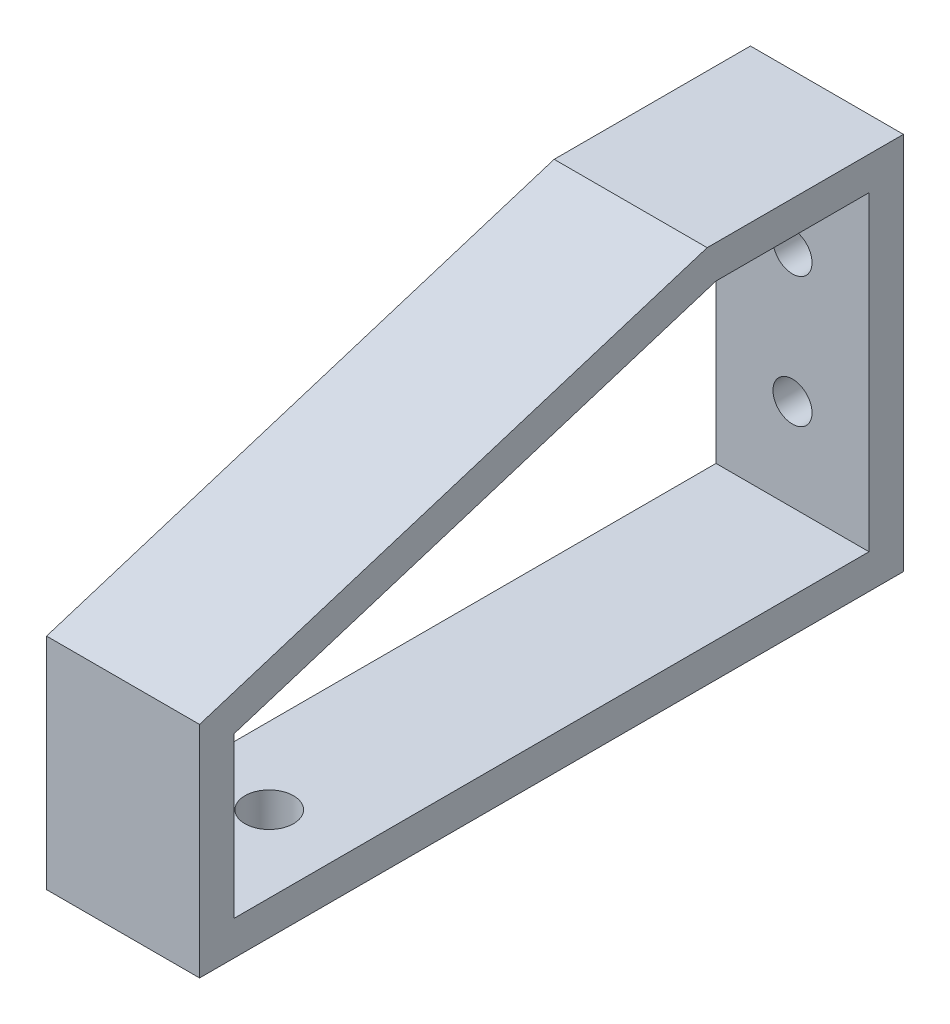
ISO-10303-21;
HEADER;
FILE_DESCRIPTION(('STEP AP214'),'2;1');
FILE_NAME('part.step','',(''),(''),'','','');
FILE_SCHEMA(('AUTOMOTIVE_DESIGN { 1 0 10303 214 1 1 1 1 }'));
ENDSEC;
DATA;
#1=APPLICATION_CONTEXT('core data for automotive mechanical design processes');
#2=APPLICATION_PROTOCOL_DEFINITION('international standard','automotive_design',2000,#1);
#3=PRODUCT_CONTEXT('',#1,'mechanical');
#4=PRODUCT('Part','Part','',(#3));
#5=PRODUCT_RELATED_PRODUCT_CATEGORY('part','',(#4));
#6=PRODUCT_DEFINITION_FORMATION('','',#4);
#7=PRODUCT_DEFINITION_CONTEXT('part definition',#1,'design');
#8=PRODUCT_DEFINITION('design','',#6,#7);
#9=PRODUCT_DEFINITION_SHAPE('','',#8);
#10=(LENGTH_UNIT() NAMED_UNIT(*) SI_UNIT(.MILLI.,.METRE.));
#11=(NAMED_UNIT(*) PLANE_ANGLE_UNIT() SI_UNIT($,.RADIAN.));
#12=(NAMED_UNIT(*) SI_UNIT($,.STERADIAN.) SOLID_ANGLE_UNIT());
#13=UNCERTAINTY_MEASURE_WITH_UNIT(LENGTH_MEASURE(1.E-05),#10,'distance_accuracy_value','');
#14=(GEOMETRIC_REPRESENTATION_CONTEXT(3) GLOBAL_UNCERTAINTY_ASSIGNED_CONTEXT((#13)) GLOBAL_UNIT_ASSIGNED_CONTEXT((#10,
#11,#12)) REPRESENTATION_CONTEXT('',''));
#15=CARTESIAN_POINT('',(0.,0.,0.));
#16=DIRECTION('',(0.,0.,1.));
#17=DIRECTION('',(1.,0.,0.));
#18=AXIS2_PLACEMENT_3D('',#15,#16,#17);
#19=CARTESIAN_POINT('',(59.7375223861297,0.,4.5));
#20=DIRECTION('',(-1.,0.,0.));
#21=DIRECTION('',(0.,-1.,0.));
#22=AXIS2_PLACEMENT_3D('',#19,#20,#21);
#23=PLANE('',#22);
#24=DIRECTION('',(0.,0.,1.));
#25=VECTOR('',#24,1.);
#26=CARTESIAN_POINT('',(59.7375223861297,-80.5485327504544,0.));
#27=LINE('',#26,#25);
#28=CARTESIAN_POINT('',(59.7375223861297,-80.5485327504544,0.));
#29=VERTEX_POINT('',#28);
#30=CARTESIAN_POINT('',(59.7375223861297,-80.5485327504544,92.));
#31=VERTEX_POINT('',#30);
#32=EDGE_CURVE('E116',#29,#31,#27,.T.);
#33=ORIENTED_EDGE('',*,*,#32,.T.);
#34=DIRECTION('',(0.,1.,0.));
#35=VECTOR('',#34,1.);
#36=CARTESIAN_POINT('',(59.7375223861297,0.,92.));
#37=LINE('',#36,#35);
#38=CARTESIAN_POINT('',(59.7375223861297,-51.8430940574358,92.));
#39=VERTEX_POINT('',#38);
#40=EDGE_CURVE('E109',#31,#39,#37,.T.);
#41=ORIENTED_EDGE('',*,*,#40,.T.);
#42=DIRECTION('',(0.,0.299079339607756,-0.954228247653458));
#43=VECTOR('',#42,1.);
#44=CARTESIAN_POINT('',(59.7375223861297,-20.9499337980594,-6.56624070871699));
#45=LINE('',#44,#43);
#46=CARTESIAN_POINT('',(59.7375223861297,-31.0485327504544,25.6538664867085));
#47=VERTEX_POINT('',#46);
#48=EDGE_CURVE('E106',#39,#47,#45,.T.);
#49=ORIENTED_EDGE('',*,*,#48,.T.);
#50=DIRECTION('',(0.,0.,-1.));
#51=VECTOR('',#50,1.);
#52=CARTESIAN_POINT('',(59.7375223861297,-31.0485327504544,4.5));
#53=LINE('',#52,#51);
#54=CARTESIAN_POINT('',(59.7375223861297,-31.0485327504544,0.));
#55=VERTEX_POINT('',#54);
#56=EDGE_CURVE('E11',#47,#55,#53,.T.);
#57=ORIENTED_EDGE('',*,*,#56,.T.);
#58=DIRECTION('',(0.,-1.,0.));
#59=VECTOR('',#58,1.);
#60=CARTESIAN_POINT('',(59.7375223861297,0.,0.));
#61=LINE('',#60,#59);
#62=EDGE_CURVE('E90',#55,#29,#61,.T.);
#63=ORIENTED_EDGE('',*,*,#62,.T.);
#64=EDGE_LOOP('',(#33,#41,#49,#57,#63));
#65=FACE_BOUND('',#64,.T.);
#66=DIRECTION('',(0.,-1.,0.));
#67=VECTOR('',#66,1.);
#68=CARTESIAN_POINT('',(59.7375223861297,0.,4.5));
#69=LINE('',#68,#67);
#70=CARTESIAN_POINT('',(59.7375223861297,-35.4027345710115,4.5));
#71=VERTEX_POINT('',#70);
#72=CARTESIAN_POINT('',(59.7375223861297,-76.0485327504544,4.5));
#73=VERTEX_POINT('',#72);
#74=EDGE_CURVE('E182',#71,#73,#69,.T.);
#75=ORIENTED_EDGE('',*,*,#74,.F.);
#76=DIRECTION('',(0.,0.,-1.));
#77=VECTOR('',#76,1.);
#78=CARTESIAN_POINT('',(59.7375223861297,-35.4027345710115,0.));
#79=LINE('',#78,#77);
#80=CARTESIAN_POINT('',(59.7375223861297,-35.4027345710115,24.5));
#81=VERTEX_POINT('',#80);
#82=EDGE_CURVE('E123',#81,#71,#79,.T.);
#83=ORIENTED_EDGE('',*,*,#82,.F.);
#84=DIRECTION('',(0.,0.299079339607756,-0.954228247653458));
#85=VECTOR('',#84,1.);
#86=CARTESIAN_POINT('',(59.7375223861297,-25.2439609125,-7.91209773695189));
#87=LINE('',#86,#85);
#88=CARTESIAN_POINT('',(59.7375223861297,-55.1485327504544,87.5));
#89=VERTEX_POINT('',#88);
#90=EDGE_CURVE('E126',#89,#81,#87,.T.);
#91=ORIENTED_EDGE('',*,*,#90,.F.);
#92=DIRECTION('',(0.,1.,0.));
#93=VECTOR('',#92,1.);
#94=CARTESIAN_POINT('',(59.7375223861297,0.,87.5));
#95=LINE('',#94,#93);
#96=CARTESIAN_POINT('',(59.7375223861297,-76.0485327504544,87.5));
#97=VERTEX_POINT('',#96);
#98=EDGE_CURVE('E153',#97,#89,#95,.T.);
#99=ORIENTED_EDGE('',*,*,#98,.F.);
#100=DIRECTION('',(0.,0.,1.));
#101=VECTOR('',#100,1.);
#102=CARTESIAN_POINT('',(59.7375223861297,-76.0485327504544,0.));
#103=LINE('',#102,#101);
#104=EDGE_CURVE('E125',#73,#97,#103,.T.);
#105=ORIENTED_EDGE('',*,*,#104,.F.);
#106=EDGE_LOOP('',(#75,#83,#91,#99,#105));
#107=FACE_BOUND('',#106,.T.);
#108=ADVANCED_FACE('F41',(#65,#107),#23,.T.);
#109=CARTESIAN_POINT('',(0.,-31.0485327504544,4.5));
#110=DIRECTION('',(0.,1.,0.));
#111=DIRECTION('',(0.,0.,-1.));
#112=AXIS2_PLACEMENT_3D('',#109,#110,#111);
#113=PLANE('',#112);
#114=DIRECTION('',(-1.,0.,0.));
#115=VECTOR('',#114,1.);
#116=CARTESIAN_POINT('',(0.,-31.0485327504544,0.));
#117=LINE('',#116,#115);
#118=CARTESIAN_POINT('',(79.7375223861297,-31.0485327504544,0.));
#119=VERTEX_POINT('',#118);
#120=EDGE_CURVE('E81',#119,#55,#117,.T.);
#121=ORIENTED_EDGE('',*,*,#120,.T.);
#122=ORIENTED_EDGE('',*,*,#56,.F.);
#123=DIRECTION('',(-1.,0.,0.));
#124=VECTOR('',#123,1.);
#125=CARTESIAN_POINT('',(184.20881030774,-31.0485327504545,25.6538664867085));
#126=LINE('',#125,#124);
#127=CARTESIAN_POINT('',(79.7375223861297,-31.0485327504544,25.6538664867085));
#128=VERTEX_POINT('',#127);
#129=EDGE_CURVE('E152',#128,#47,#126,.T.);
#130=ORIENTED_EDGE('',*,*,#129,.F.);
#131=DIRECTION('',(0.,0.,-1.));
#132=VECTOR('',#131,1.);
#133=CARTESIAN_POINT('',(79.7375223861297,-31.0485327504544,4.5));
#134=LINE('',#133,#132);
#135=EDGE_CURVE('E50',#128,#119,#134,.T.);
#136=ORIENTED_EDGE('',*,*,#135,.T.);
#137=EDGE_LOOP('',(#121,#122,#130,#136));
#138=FACE_BOUND('',#137,.T.);
#139=ADVANCED_FACE('F83',(#138),#113,.T.);
#140=CARTESIAN_POINT('',(79.7375223861297,0.,4.5));
#141=DIRECTION('',(-1.,0.,0.));
#142=DIRECTION('',(0.,0.,-1.));
#143=AXIS2_PLACEMENT_3D('',#140,#141,#142);
#144=PLANE('',#143);
#145=DIRECTION('',(0.,-1.,0.));
#146=VECTOR('',#145,1.);
#147=CARTESIAN_POINT('',(79.7375223861297,0.,0.));
#148=LINE('',#147,#146);
#149=CARTESIAN_POINT('',(79.7375223861297,-80.5485327504544,0.));
#150=VERTEX_POINT('',#149);
#151=EDGE_CURVE('E91',#119,#150,#148,.T.);
#152=ORIENTED_EDGE('',*,*,#151,.F.);
#153=ORIENTED_EDGE('',*,*,#135,.F.);
#154=DIRECTION('',(0.,-0.299079339607756,0.954228247653458));
#155=VECTOR('',#154,1.);
#156=CARTESIAN_POINT('',(79.7375223861297,-20.9499337980594,-6.56624070871698));
#157=LINE('',#156,#155);
#158=CARTESIAN_POINT('',(79.7375223861297,-51.8430940574358,92.));
#159=VERTEX_POINT('',#158);
#160=EDGE_CURVE('E129',#128,#159,#157,.T.);
#161=ORIENTED_EDGE('',*,*,#160,.T.);
#162=DIRECTION('',(0.,-1.,0.));
#163=VECTOR('',#162,1.);
#164=CARTESIAN_POINT('',(79.7375223861297,0.,92.));
#165=LINE('',#164,#163);
#166=CARTESIAN_POINT('',(79.7375223861297,-80.5485327504545,92.));
#167=VERTEX_POINT('',#166);
#168=EDGE_CURVE('E132',#159,#167,#165,.T.);
#169=ORIENTED_EDGE('',*,*,#168,.T.);
#170=DIRECTION('',(0.,0.,-1.));
#171=VECTOR('',#170,1.);
#172=CARTESIAN_POINT('',(79.7375223861297,-80.5485327504544,0.));
#173=LINE('',#172,#171);
#174=EDGE_CURVE('E136',#167,#150,#173,.T.);
#175=ORIENTED_EDGE('',*,*,#174,.T.);
#176=EDGE_LOOP('',(#152,#153,#161,#169,#175));
#177=FACE_BOUND('',#176,.T.);
#178=DIRECTION('',(0.,0.,-1.));
#179=VECTOR('',#178,1.);
#180=CARTESIAN_POINT('',(79.7375223861297,-76.0485327504544,0.));
#181=LINE('',#180,#179);
#182=CARTESIAN_POINT('',(79.7375223861297,-76.0485327504544,87.5));
#183=VERTEX_POINT('',#182);
#184=CARTESIAN_POINT('',(79.7375223861297,-76.0485327504545,4.5));
#185=VERTEX_POINT('',#184);
#186=EDGE_CURVE('E139',#183,#185,#181,.T.);
#187=ORIENTED_EDGE('',*,*,#186,.F.);
#188=DIRECTION('',(0.,-1.,0.));
#189=VECTOR('',#188,1.);
#190=CARTESIAN_POINT('',(79.7375223861297,0.,87.5));
#191=LINE('',#190,#189);
#192=CARTESIAN_POINT('',(79.7375223861297,-55.1485327504544,87.5));
#193=VERTEX_POINT('',#192);
#194=EDGE_CURVE('E141',#193,#183,#191,.T.);
#195=ORIENTED_EDGE('',*,*,#194,.F.);
#196=DIRECTION('',(0.,-0.299079339607756,0.954228247653458));
#197=VECTOR('',#196,1.);
#198=CARTESIAN_POINT('',(79.7375223861297,-25.2439609125,-7.91209773695188));
#199=LINE('',#198,#197);
#200=CARTESIAN_POINT('',(79.7375223861297,-35.4027345710115,24.5));
#201=VERTEX_POINT('',#200);
#202=EDGE_CURVE('E144',#201,#193,#199,.T.);
#203=ORIENTED_EDGE('',*,*,#202,.F.);
#204=DIRECTION('',(0.,0.,1.));
#205=VECTOR('',#204,1.);
#206=CARTESIAN_POINT('',(79.7375223861297,-35.4027345710115,0.));
#207=LINE('',#206,#205);
#208=CARTESIAN_POINT('',(79.7375223861297,-35.4027345710116,4.5));
#209=VERTEX_POINT('',#208);
#210=EDGE_CURVE('E147',#209,#201,#207,.T.);
#211=ORIENTED_EDGE('',*,*,#210,.F.);
#212=DIRECTION('',(0.,-1.,0.));
#213=VECTOR('',#212,1.);
#214=CARTESIAN_POINT('',(79.7375223861297,0.,4.5));
#215=LINE('',#214,#213);
#216=EDGE_CURVE('E179',#209,#185,#215,.T.);
#217=ORIENTED_EDGE('',*,*,#216,.T.);
#218=EDGE_LOOP('',(#187,#195,#203,#211,#217));
#219=FACE_BOUND('',#218,.T.);
#220=ADVANCED_FACE('F43',(#177,#219),#144,.F.);
#221=CARTESIAN_POINT('',(0.,0.,4.5));
#222=DIRECTION('',(0.,0.,-1.));
#223=DIRECTION('',(1.,0.,0.));
#224=AXIS2_PLACEMENT_3D('',#221,#222,#223);
#225=PLANE('',#224);
#226=CARTESIAN_POINT('',(69.7375223861297,-64.0485327504545,4.5));
#227=DIRECTION('',(0.,0.,-1.));
#228=DIRECTION('',(-1.,0.,0.));
#229=AXIS2_PLACEMENT_3D('',#226,#227,#228);
#230=CIRCLE('',#229,2.55269999999999);
#231=CARTESIAN_POINT('',(67.1848223861297,-64.0485327504545,4.5));
#232=VERTEX_POINT('',#231);
#233=EDGE_CURVE('E150',#232,#232,#230,.T.);
#234=ORIENTED_EDGE('',*,*,#233,.T.);
#235=EDGE_LOOP('',(#234));
#236=FACE_BOUND('',#235,.T.);
#237=CARTESIAN_POINT('',(69.7375223861297,-47.0485327504545,4.5));
#238=DIRECTION('',(0.,0.,-1.));
#239=DIRECTION('',(-1.,0.,0.));
#240=AXIS2_PLACEMENT_3D('',#237,#238,#239);
#241=CIRCLE('',#240,2.55269999999999);
#242=CARTESIAN_POINT('',(67.1848223861297,-47.0485327504545,4.5));
#243=VERTEX_POINT('',#242);
#244=EDGE_CURVE('E172',#243,#243,#241,.T.);
#245=ORIENTED_EDGE('',*,*,#244,.T.);
#246=EDGE_LOOP('',(#245));
#247=FACE_BOUND('',#246,.T.);
#248=ORIENTED_EDGE('',*,*,#74,.T.);
#249=DIRECTION('',(-1.,0.,0.));
#250=VECTOR('',#249,1.);
#251=CARTESIAN_POINT('',(0.,-76.0485327504544,4.5));
#252=LINE('',#251,#250);
#253=EDGE_CURVE('E67',#185,#73,#252,.T.);
#254=ORIENTED_EDGE('',*,*,#253,.F.);
#255=ORIENTED_EDGE('',*,*,#216,.F.);
#256=DIRECTION('',(-1.,0.,0.));
#257=VECTOR('',#256,1.);
#258=CARTESIAN_POINT('',(184.20881030774,-35.4027345710116,4.5));
#259=LINE('',#258,#257);
#260=EDGE_CURVE('E58',#209,#71,#259,.T.);
#261=ORIENTED_EDGE('',*,*,#260,.T.);
#262=EDGE_LOOP('',(#248,#254,#255,#261));
#263=FACE_BOUND('',#262,.T.);
#264=ADVANCED_FACE('F225',(#236,#247,#263),#225,.F.);
#265=CARTESIAN_POINT('',(0.,0.,0.));
#266=DIRECTION('',(0.,0.,-1.));
#267=DIRECTION('',(1.,0.,0.));
#268=AXIS2_PLACEMENT_3D('',#265,#266,#267);
#269=PLANE('',#268);
#270=CARTESIAN_POINT('',(69.7375223861297,-64.0485327504545,0.));
#271=DIRECTION('',(0.,0.,1.));
#272=DIRECTION('',(1.,0.,0.));
#273=AXIS2_PLACEMENT_3D('',#270,#271,#272);
#274=CIRCLE('',#273,2.55269999999999);
#275=CARTESIAN_POINT('',(72.2902223861296,-64.0485327504545,0.));
#276=VERTEX_POINT('',#275);
#277=EDGE_CURVE('E45',#276,#276,#274,.T.);
#278=ORIENTED_EDGE('',*,*,#277,.T.);
#279=EDGE_LOOP('',(#278));
#280=FACE_BOUND('',#279,.T.);
#281=CARTESIAN_POINT('',(69.7375223861297,-47.0485327504545,0.));
#282=DIRECTION('',(0.,0.,1.));
#283=DIRECTION('',(1.,0.,0.));
#284=AXIS2_PLACEMENT_3D('',#281,#282,#283);
#285=CIRCLE('',#284,2.55269999999999);
#286=CARTESIAN_POINT('',(72.2902223861296,-47.0485327504545,0.));
#287=VERTEX_POINT('',#286);
#288=EDGE_CURVE('E175',#287,#287,#285,.T.);
#289=ORIENTED_EDGE('',*,*,#288,.T.);
#290=EDGE_LOOP('',(#289));
#291=FACE_BOUND('',#290,.T.);
#292=ORIENTED_EDGE('',*,*,#62,.F.);
#293=ORIENTED_EDGE('',*,*,#120,.F.);
#294=ORIENTED_EDGE('',*,*,#151,.T.);
#295=DIRECTION('',(-1.,0.,0.));
#296=VECTOR('',#295,1.);
#297=CARTESIAN_POINT('',(184.20881030774,-80.5485327504545,0.));
#298=LINE('',#297,#296);
#299=EDGE_CURVE('E98',#150,#29,#298,.T.);
#300=ORIENTED_EDGE('',*,*,#299,.T.);
#301=EDGE_LOOP('',(#292,#293,#294,#300));
#302=FACE_BOUND('',#301,.T.);
#303=ADVANCED_FACE('F95',(#280,#291,#302),#269,.T.);
#304=CARTESIAN_POINT('',(69.7375223861297,-47.0485327504545,4.5));
#305=DIRECTION('',(0.,0.,1.));
#306=DIRECTION('',(-1.,0.,0.));
#307=AXIS2_PLACEMENT_3D('',#304,#305,#306);
#308=CYLINDRICAL_SURFACE('',#307,2.55269999999999);
#309=ORIENTED_EDGE('',*,*,#288,.F.);
#310=EDGE_LOOP('',(#309));
#311=FACE_BOUND('',#310,.T.);
#312=ORIENTED_EDGE('',*,*,#244,.F.);
#313=EDGE_LOOP('',(#312));
#314=FACE_BOUND('',#313,.T.);
#315=ADVANCED_FACE('F224',(#311,#314),#308,.F.);
#316=CARTESIAN_POINT('',(69.7375223861297,-64.0485327504545,4.5));
#317=DIRECTION('',(0.,0.,1.));
#318=DIRECTION('',(-1.,0.,0.));
#319=AXIS2_PLACEMENT_3D('',#316,#317,#318);
#320=CYLINDRICAL_SURFACE('',#319,2.55269999999999);
#321=ORIENTED_EDGE('',*,*,#277,.F.);
#322=EDGE_LOOP('',(#321));
#323=FACE_BOUND('',#322,.T.);
#324=ORIENTED_EDGE('',*,*,#233,.F.);
#325=EDGE_LOOP('',(#324));
#326=FACE_BOUND('',#325,.T.);
#327=ADVANCED_FACE('F232',(#323,#326),#320,.F.);
#328=CARTESIAN_POINT('',(184.20881030774,-76.0485327504545,0.));
#329=DIRECTION('',(0.,1.,0.));
#330=DIRECTION('',(-1.,0.,0.));
#331=AXIS2_PLACEMENT_3D('',#328,#329,#330);
#332=PLANE('',#331);
#333=CARTESIAN_POINT('',(69.7375223861297,-76.0485327504544,72.9));
#334=DIRECTION('',(0.,-1.,0.));
#335=DIRECTION('',(-1.,0.,0.));
#336=AXIS2_PLACEMENT_3D('',#333,#334,#335);
#337=CIRCLE('',#336,3.17499999999998);
#338=CARTESIAN_POINT('',(66.5625223861297,-76.0485327504544,72.9));
#339=VERTEX_POINT('',#338);
#340=EDGE_CURVE('E114',#339,#339,#337,.T.);
#341=ORIENTED_EDGE('',*,*,#340,.T.);
#342=EDGE_LOOP('',(#341));
#343=FACE_BOUND('',#342,.T.);
#344=ORIENTED_EDGE('',*,*,#253,.T.);
#345=ORIENTED_EDGE('',*,*,#104,.T.);
#346=DIRECTION('',(-1.,0.,0.));
#347=VECTOR('',#346,1.);
#348=CARTESIAN_POINT('',(184.20881030774,-76.0485327504545,87.5));
#349=LINE('',#348,#347);
#350=EDGE_CURVE('E162',#183,#97,#349,.T.);
#351=ORIENTED_EDGE('',*,*,#350,.F.);
#352=ORIENTED_EDGE('',*,*,#186,.T.);
#353=EDGE_LOOP('',(#344,#345,#351,#352));
#354=FACE_BOUND('',#353,.T.);
#355=ADVANCED_FACE('F214',(#343,#354),#332,.T.);
#356=CARTESIAN_POINT('',(184.20881030774,-20.9499337980594,-6.56624070871698));
#357=DIRECTION('',(0.,-0.954228247653458,-0.299079339607756));
#358=DIRECTION('',(0.,-0.299079339607756,0.954228247653458));
#359=AXIS2_PLACEMENT_3D('',#356,#357,#358);
#360=PLANE('',#359);
#361=ORIENTED_EDGE('',*,*,#129,.T.);
#362=ORIENTED_EDGE('',*,*,#48,.F.);
#363=DIRECTION('',(-1.,0.,0.));
#364=VECTOR('',#363,1.);
#365=CARTESIAN_POINT('',(184.20881030774,-51.8430940574359,92.));
#366=LINE('',#365,#364);
#367=EDGE_CURVE('E155',#159,#39,#366,.T.);
#368=ORIENTED_EDGE('',*,*,#367,.F.);
#369=ORIENTED_EDGE('',*,*,#160,.F.);
#370=EDGE_LOOP('',(#361,#362,#368,#369));
#371=FACE_BOUND('',#370,.T.);
#372=ADVANCED_FACE('F203',(#371),#360,.F.);
#373=CARTESIAN_POINT('',(184.20881030774,0.,92.));
#374=DIRECTION('',(0.,0.,-1.));
#375=DIRECTION('',(1.,0.,0.));
#376=AXIS2_PLACEMENT_3D('',#373,#374,#375);
#377=PLANE('',#376);
#378=ORIENTED_EDGE('',*,*,#367,.T.);
#379=ORIENTED_EDGE('',*,*,#40,.F.);
#380=DIRECTION('',(-1.,0.,0.));
#381=VECTOR('',#380,1.);
#382=CARTESIAN_POINT('',(184.20881030774,-80.5485327504545,92.));
#383=LINE('',#382,#381);
#384=EDGE_CURVE('E158',#167,#31,#383,.T.);
#385=ORIENTED_EDGE('',*,*,#384,.F.);
#386=ORIENTED_EDGE('',*,*,#168,.F.);
#387=EDGE_LOOP('',(#378,#379,#385,#386));
#388=FACE_BOUND('',#387,.T.);
#389=ADVANCED_FACE('F204',(#388),#377,.F.);
#390=CARTESIAN_POINT('',(184.20881030774,-80.5485327504545,0.));
#391=DIRECTION('',(0.,1.,0.));
#392=DIRECTION('',(-1.,0.,0.));
#393=AXIS2_PLACEMENT_3D('',#390,#391,#392);
#394=PLANE('',#393);
#395=CARTESIAN_POINT('',(69.7375223861297,-80.5485327504544,72.9));
#396=DIRECTION('',(0.,1.,0.));
#397=DIRECTION('',(0.,0.,1.));
#398=AXIS2_PLACEMENT_3D('',#395,#396,#397);
#399=CIRCLE('',#398,3.17499999999998);
#400=CARTESIAN_POINT('',(69.7375223861297,-80.5485327504544,76.0749999999999));
#401=VERTEX_POINT('',#400);
#402=EDGE_CURVE('E119',#401,#401,#399,.T.);
#403=ORIENTED_EDGE('',*,*,#402,.T.);
#404=EDGE_LOOP('',(#403));
#405=FACE_BOUND('',#404,.T.);
#406=ORIENTED_EDGE('',*,*,#384,.T.);
#407=ORIENTED_EDGE('',*,*,#32,.F.);
#408=ORIENTED_EDGE('',*,*,#299,.F.);
#409=ORIENTED_EDGE('',*,*,#174,.F.);
#410=EDGE_LOOP('',(#406,#407,#408,#409));
#411=FACE_BOUND('',#410,.T.);
#412=ADVANCED_FACE('F193',(#405,#411),#394,.F.);
#413=CARTESIAN_POINT('',(184.20881030774,0.,87.5));
#414=DIRECTION('',(0.,0.,-1.));
#415=DIRECTION('',(1.,0.,0.));
#416=AXIS2_PLACEMENT_3D('',#413,#414,#415);
#417=PLANE('',#416);
#418=ORIENTED_EDGE('',*,*,#194,.T.);
#419=ORIENTED_EDGE('',*,*,#350,.T.);
#420=ORIENTED_EDGE('',*,*,#98,.T.);
#421=DIRECTION('',(-1.,0.,0.));
#422=VECTOR('',#421,1.);
#423=CARTESIAN_POINT('',(184.20881030774,-55.1485327504545,87.5));
#424=LINE('',#423,#422);
#425=EDGE_CURVE('E165',#193,#89,#424,.T.);
#426=ORIENTED_EDGE('',*,*,#425,.F.);
#427=EDGE_LOOP('',(#418,#419,#420,#426));
#428=FACE_BOUND('',#427,.T.);
#429=ADVANCED_FACE('F211',(#428),#417,.T.);
#430=CARTESIAN_POINT('',(184.20881030774,-25.2439609125,-7.91209773695189));
#431=DIRECTION('',(0.,-0.954228247653458,-0.299079339607756));
#432=DIRECTION('',(0.,-0.299079339607756,0.954228247653458));
#433=AXIS2_PLACEMENT_3D('',#430,#431,#432);
#434=PLANE('',#433);
#435=ORIENTED_EDGE('',*,*,#202,.T.);
#436=ORIENTED_EDGE('',*,*,#425,.T.);
#437=ORIENTED_EDGE('',*,*,#90,.T.);
#438=DIRECTION('',(-1.,0.,0.));
#439=VECTOR('',#438,1.);
#440=CARTESIAN_POINT('',(184.20881030774,-35.4027345710116,24.5));
#441=LINE('',#440,#439);
#442=EDGE_CURVE('E133',#201,#81,#441,.T.);
#443=ORIENTED_EDGE('',*,*,#442,.F.);
#444=EDGE_LOOP('',(#435,#436,#437,#443));
#445=FACE_BOUND('',#444,.T.);
#446=ADVANCED_FACE('F241',(#445),#434,.T.);
#447=CARTESIAN_POINT('',(184.20881030774,-35.4027345710116,0.));
#448=DIRECTION('',(0.,-1.,0.));
#449=DIRECTION('',(1.,0.,0.));
#450=AXIS2_PLACEMENT_3D('',#447,#448,#449);
#451=PLANE('',#450);
#452=ORIENTED_EDGE('',*,*,#210,.T.);
#453=ORIENTED_EDGE('',*,*,#442,.T.);
#454=ORIENTED_EDGE('',*,*,#82,.T.);
#455=ORIENTED_EDGE('',*,*,#260,.F.);
#456=EDGE_LOOP('',(#452,#453,#454,#455));
#457=FACE_BOUND('',#456,.T.);
#458=ADVANCED_FACE('F237',(#457),#451,.T.);
#459=CARTESIAN_POINT('',(69.7375223861297,-80.5485327504544,72.9));
#460=DIRECTION('',(0.,-1.,0.));
#461=DIRECTION('',(0.,0.,1.));
#462=AXIS2_PLACEMENT_3D('',#459,#460,#461);
#463=CYLINDRICAL_SURFACE('',#462,3.17499999999998);
#464=ORIENTED_EDGE('',*,*,#340,.F.);
#465=EDGE_LOOP('',(#464));
#466=FACE_BOUND('',#465,.T.);
#467=ORIENTED_EDGE('',*,*,#402,.F.);
#468=EDGE_LOOP('',(#467));
#469=FACE_BOUND('',#468,.T.);
#470=ADVANCED_FACE('F240',(#466,#469),#463,.F.);
#471=CLOSED_SHELL('',(#108,#139,#220,#264,#303,#315,#327,#355,#372,#389,#412,#429,#446,#458,#470));
#472=MANIFOLD_SOLID_BREP('B2',#471);
#473=ADVANCED_BREP_SHAPE_REPRESENTATION('',(#18,#472),#14);
#474=SHAPE_DEFINITION_REPRESENTATION(#9,#473);
ENDSEC;
END-ISO-10303-21;
